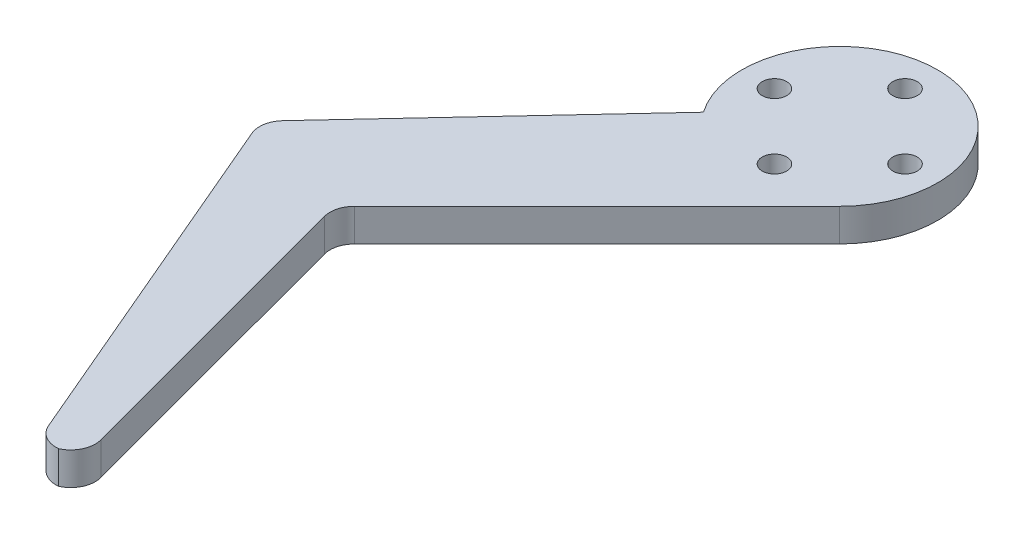
ISO-10303-21;
HEADER;
FILE_DESCRIPTION(('STEP AP214'),'2;1');
FILE_NAME('part.step','',(''),(''),'','','');
FILE_SCHEMA(('AUTOMOTIVE_DESIGN { 1 0 10303 214 1 1 1 1 }'));
ENDSEC;
DATA;
#1=APPLICATION_CONTEXT('core data for automotive mechanical design processes');
#2=APPLICATION_PROTOCOL_DEFINITION('international standard','automotive_design',2000,#1);
#3=PRODUCT_CONTEXT('',#1,'mechanical');
#4=PRODUCT('Part','Part','',(#3));
#5=PRODUCT_RELATED_PRODUCT_CATEGORY('part','',(#4));
#6=PRODUCT_DEFINITION_FORMATION('','',#4);
#7=PRODUCT_DEFINITION_CONTEXT('part definition',#1,'design');
#8=PRODUCT_DEFINITION('design','',#6,#7);
#9=PRODUCT_DEFINITION_SHAPE('','',#8);
#10=(LENGTH_UNIT() NAMED_UNIT(*) SI_UNIT(.MILLI.,.METRE.));
#11=(NAMED_UNIT(*) PLANE_ANGLE_UNIT() SI_UNIT($,.RADIAN.));
#12=(NAMED_UNIT(*) SI_UNIT($,.STERADIAN.) SOLID_ANGLE_UNIT());
#13=UNCERTAINTY_MEASURE_WITH_UNIT(LENGTH_MEASURE(1.E-05),#10,'distance_accuracy_value','');
#14=(GEOMETRIC_REPRESENTATION_CONTEXT(3) GLOBAL_UNCERTAINTY_ASSIGNED_CONTEXT((#13)) GLOBAL_UNIT_ASSIGNED_CONTEXT((#10,
#11,#12)) REPRESENTATION_CONTEXT('',''));
#15=CARTESIAN_POINT('',(0.,0.,0.));
#16=DIRECTION('',(0.,0.,1.));
#17=DIRECTION('',(1.,0.,0.));
#18=AXIS2_PLACEMENT_3D('',#15,#16,#17);
#19=CARTESIAN_POINT('',(0.,4.,0.));
#20=DIRECTION('',(0.,1.,0.));
#21=DIRECTION('',(0.,0.,1.));
#22=AXIS2_PLACEMENT_3D('',#19,#20,#21);
#23=PLANE('',#22);
#24=CARTESIAN_POINT('',(0.,4.,8.));
#25=DIRECTION('',(0.,1.,0.));
#26=DIRECTION('',(0.,0.,1.));
#27=AXIS2_PLACEMENT_3D('',#24,#25,#26);
#28=CIRCLE('',#27,1.5);
#29=CARTESIAN_POINT('',(0.,4.,9.5));
#30=VERTEX_POINT('',#29);
#31=EDGE_CURVE('E208',#30,#30,#28,.T.);
#32=ORIENTED_EDGE('',*,*,#31,.F.);
#33=EDGE_LOOP('',(#32));
#34=FACE_BOUND('',#33,.T.);
#35=CARTESIAN_POINT('',(0.,4.,-8.));
#36=DIRECTION('',(0.,1.,0.));
#37=DIRECTION('',(0.,0.,1.));
#38=AXIS2_PLACEMENT_3D('',#35,#36,#37);
#39=CIRCLE('',#38,1.5);
#40=CARTESIAN_POINT('',(0.,4.,-6.5));
#41=VERTEX_POINT('',#40);
#42=EDGE_CURVE('E184',#41,#41,#39,.T.);
#43=ORIENTED_EDGE('',*,*,#42,.F.);
#44=EDGE_LOOP('',(#43));
#45=FACE_BOUND('',#44,.T.);
#46=DIRECTION('',(-0.682000049696105,0.,0.731352126006693));
#47=VECTOR('',#46,1.);
#48=CARTESIAN_POINT('',(-36.0477490683532,4.,34.9435246459221));
#49=LINE('',#48,#47);
#50=CARTESIAN_POINT('',(-9.85159573268039,4.,6.85171960312398));
#51=VERTEX_POINT('',#50);
#52=CARTESIAN_POINT('',(-34.7159837227266,4.,33.515387775111));
#53=VERTEX_POINT('',#52);
#54=EDGE_CURVE('E103',#51,#53,#49,.T.);
#55=ORIENTED_EDGE('',*,*,#54,.T.);
#56=CARTESIAN_POINT('',(-32.5219273447065,4.,35.5613879241993));
#57=DIRECTION('',(0.,1.,0.));
#58=DIRECTION('',(0.,0.,1.));
#59=AXIS2_PLACEMENT_3D('',#56,#57,#58);
#60=CIRCLE('',#59,3.);
#61=CARTESIAN_POINT('',(-35.2809600085623,4.,36.7394111666598));
#62=VERTEX_POINT('',#61);
#63=EDGE_CURVE('E148',#53,#62,#60,.T.);
#64=ORIENTED_EDGE('',*,*,#63,.T.);
#65=DIRECTION('',(0.392674414153484,0.,0.919677554618584));
#66=VECTOR('',#65,1.);
#67=CARTESIAN_POINT('',(-15.6800453841502,4.,82.6464542036449));
#68=LINE('',#67,#66);
#69=CARTESIAN_POINT('',(-16.7016030868715,4.,80.2538774120915));
#70=VERTEX_POINT('',#69);
#71=EDGE_CURVE('E113',#62,#70,#68,.T.);
#72=ORIENTED_EDGE('',*,*,#71,.T.);
#73=CARTESIAN_POINT('',(-13.9425704230157,4.,79.075854169631));
#74=DIRECTION('',(0.,1.,0.));
#75=DIRECTION('',(0.,0.,1.));
#76=AXIS2_PLACEMENT_3D('',#73,#74,#75);
#77=CIRCLE('',#76,3.);
#78=CARTESIAN_POINT('',(-13.6523806970116,4.,82.0617861720252));
#79=VERTEX_POINT('',#78);
#80=EDGE_CURVE('E49',#70,#79,#77,.T.);
#81=ORIENTED_EDGE('',*,*,#80,.T.);
#82=CARTESIAN_POINT('',(-14.8924461188136,4.,79.3300764968125));
#83=DIRECTION('',(0.,1.,0.));
#84=DIRECTION('',(0.,0.,1.));
#85=AXIS2_PLACEMENT_3D('',#82,#83,#84);
#86=CIRCLE('',#85,3.);
#87=CARTESIAN_POINT('',(-11.9944429187215,4.,78.5544622549008));
#88=VERTEX_POINT('',#87);
#89=EDGE_CURVE('E145',#79,#88,#86,.T.);
#90=ORIENTED_EDGE('',*,*,#89,.T.);
#91=DIRECTION('',(-0.258538080637228,0.,-0.96600106669735));
#92=VECTOR('',#91,1.);
#93=CARTESIAN_POINT('',(-22.4643106676899,4.,39.4348734161676));
#94=LINE('',#93,#92);
#95=CARTESIAN_POINT('',(-22.0166599628016,4.,41.1074744402182));
#96=VERTEX_POINT('',#95);
#97=EDGE_CURVE('E177',#88,#96,#94,.T.);
#98=ORIENTED_EDGE('',*,*,#97,.T.);
#99=CARTESIAN_POINT('',(-19.1186567627096,4.,40.3318601983065));
#100=DIRECTION('',(0.,1.,0.));
#101=DIRECTION('',(0.,0.,1.));
#102=AXIS2_PLACEMENT_3D('',#99,#100,#101);
#103=CIRCLE('',#102,3.);
#104=CARTESIAN_POINT('',(-21.2399771062692,4.,38.2105398547469));
#105=VERTEX_POINT('',#104);
#106=EDGE_CURVE('E11',#96,#105,#103,.F.);
#107=ORIENTED_EDGE('',*,*,#106,.T.);
#108=DIRECTION('',(0.707106781186541,0.,-0.707106781186554));
#109=VECTOR('',#108,1.);
#110=CARTESIAN_POINT('',(0.,4.,16.9705627484773));
#111=LINE('',#110,#109);
#112=CARTESIAN_POINT('',(8.48528137423867,4.,8.48528137423847));
#113=VERTEX_POINT('',#112);
#114=EDGE_CURVE('E118',#105,#113,#111,.T.);
#115=ORIENTED_EDGE('',*,*,#114,.T.);
#116=CARTESIAN_POINT('',(0.,4.,0.));
#117=DIRECTION('',(0.,1.,0.));
#118=DIRECTION('',(0.,0.,1.));
#119=AXIS2_PLACEMENT_3D('',#116,#117,#118);
#120=CIRCLE('',#119,12.);
#121=EDGE_CURVE('E114',#113,#51,#120,.T.);
#122=ORIENTED_EDGE('',*,*,#121,.T.);
#123=EDGE_LOOP('',(#55,#64,#72,#81,#90,#98,#107,#115,#122));
#124=FACE_BOUND('',#123,.T.);
#125=CARTESIAN_POINT('',(8.,4.,0.));
#126=DIRECTION('',(0.,1.,0.));
#127=DIRECTION('',(0.,0.,1.));
#128=AXIS2_PLACEMENT_3D('',#125,#126,#127);
#129=CIRCLE('',#128,1.5);
#130=CARTESIAN_POINT('',(8.,4.,1.5));
#131=VERTEX_POINT('',#130);
#132=EDGE_CURVE('E214',#131,#131,#129,.T.);
#133=ORIENTED_EDGE('',*,*,#132,.F.);
#134=EDGE_LOOP('',(#133));
#135=FACE_BOUND('',#134,.T.);
#136=CARTESIAN_POINT('',(-8.,4.,0.));
#137=DIRECTION('',(0.,1.,0.));
#138=DIRECTION('',(0.,0.,1.));
#139=AXIS2_PLACEMENT_3D('',#136,#137,#138);
#140=CIRCLE('',#139,1.5);
#141=CARTESIAN_POINT('',(-8.,4.,1.5));
#142=VERTEX_POINT('',#141);
#143=EDGE_CURVE('E200',#142,#142,#140,.T.);
#144=ORIENTED_EDGE('',*,*,#143,.F.);
#145=EDGE_LOOP('',(#144));
#146=FACE_BOUND('',#145,.T.);
#147=ADVANCED_FACE('F33',(#34,#45,#124,#135,#146),#23,.T.);
#148=CARTESIAN_POINT('',(0.,0.,0.));
#149=DIRECTION('',(0.,1.,0.));
#150=DIRECTION('',(0.,0.,1.));
#151=AXIS2_PLACEMENT_3D('',#148,#149,#150);
#152=PLANE('',#151);
#153=CARTESIAN_POINT('',(0.,0.,8.));
#154=DIRECTION('',(0.,1.,0.));
#155=DIRECTION('',(0.,0.,1.));
#156=AXIS2_PLACEMENT_3D('',#153,#154,#155);
#157=CIRCLE('',#156,1.5);
#158=CARTESIAN_POINT('',(0.,0.,9.5));
#159=VERTEX_POINT('',#158);
#160=EDGE_CURVE('E205',#159,#159,#157,.T.);
#161=ORIENTED_EDGE('',*,*,#160,.T.);
#162=EDGE_LOOP('',(#161));
#163=FACE_BOUND('',#162,.T.);
#164=CARTESIAN_POINT('',(0.,0.,-8.));
#165=DIRECTION('',(0.,1.,0.));
#166=DIRECTION('',(0.,0.,1.));
#167=AXIS2_PLACEMENT_3D('',#164,#165,#166);
#168=CIRCLE('',#167,1.5);
#169=CARTESIAN_POINT('',(0.,0.,-6.5));
#170=VERTEX_POINT('',#169);
#171=EDGE_CURVE('E217',#170,#170,#168,.T.);
#172=ORIENTED_EDGE('',*,*,#171,.T.);
#173=EDGE_LOOP('',(#172));
#174=FACE_BOUND('',#173,.T.);
#175=DIRECTION('',(0.392674414153484,0.,0.919677554618584));
#176=VECTOR('',#175,1.);
#177=CARTESIAN_POINT('',(-15.6800453841502,0.,82.6464542036449));
#178=LINE('',#177,#176);
#179=CARTESIAN_POINT('',(-35.2809600085623,0.,36.7394111666598));
#180=VERTEX_POINT('',#179);
#181=CARTESIAN_POINT('',(-16.7016030868715,0.,80.2538774120915));
#182=VERTEX_POINT('',#181);
#183=EDGE_CURVE('E173',#180,#182,#178,.T.);
#184=ORIENTED_EDGE('',*,*,#183,.F.);
#185=CARTESIAN_POINT('',(-32.5219273447065,0.,35.5613879241993));
#186=DIRECTION('',(0.,1.,0.));
#187=DIRECTION('',(0.,0.,1.));
#188=AXIS2_PLACEMENT_3D('',#185,#186,#187);
#189=CIRCLE('',#188,3.);
#190=CARTESIAN_POINT('',(-34.7159837227266,0.,33.515387775111));
#191=VERTEX_POINT('',#190);
#192=EDGE_CURVE('E142',#180,#191,#189,.F.);
#193=ORIENTED_EDGE('',*,*,#192,.T.);
#194=DIRECTION('',(-0.682000049696105,0.,0.731352126006693));
#195=VECTOR('',#194,1.);
#196=CARTESIAN_POINT('',(-36.0477490683532,0.,34.9435246459221));
#197=LINE('',#196,#195);
#198=CARTESIAN_POINT('',(-9.85159573268039,0.,6.85171960312398));
#199=VERTEX_POINT('',#198);
#200=EDGE_CURVE('E183',#199,#191,#197,.T.);
#201=ORIENTED_EDGE('',*,*,#200,.F.);
#202=CARTESIAN_POINT('',(0.,0.,0.));
#203=DIRECTION('',(0.,1.,0.));
#204=DIRECTION('',(0.,0.,1.));
#205=AXIS2_PLACEMENT_3D('',#202,#203,#204);
#206=CIRCLE('',#205,12.);
#207=CARTESIAN_POINT('',(8.48528137423867,0.,8.48528137423847));
#208=VERTEX_POINT('',#207);
#209=EDGE_CURVE('E126',#208,#199,#206,.T.);
#210=ORIENTED_EDGE('',*,*,#209,.F.);
#211=DIRECTION('',(0.707106781186541,0.,-0.707106781186554));
#212=VECTOR('',#211,1.);
#213=CARTESIAN_POINT('',(8.48528137423867,0.,8.48528137423847));
#214=LINE('',#213,#212);
#215=CARTESIAN_POINT('',(-21.2399771062692,0.,38.2105398547469));
#216=VERTEX_POINT('',#215);
#217=EDGE_CURVE('E122',#216,#208,#214,.T.);
#218=ORIENTED_EDGE('',*,*,#217,.F.);
#219=CARTESIAN_POINT('',(-19.1186567627096,0.,40.3318601983065));
#220=DIRECTION('',(0.,1.,0.));
#221=DIRECTION('',(0.,0.,1.));
#222=AXIS2_PLACEMENT_3D('',#219,#220,#221);
#223=CIRCLE('',#222,3.);
#224=CARTESIAN_POINT('',(-22.0166599628016,0.,41.1074744402182));
#225=VERTEX_POINT('',#224);
#226=EDGE_CURVE('E42',#216,#225,#223,.T.);
#227=ORIENTED_EDGE('',*,*,#226,.T.);
#228=DIRECTION('',(-0.258538080637228,0.,-0.96600106669735));
#229=VECTOR('',#228,1.);
#230=CARTESIAN_POINT('',(-22.4643106676899,0.,39.4348734161676));
#231=LINE('',#230,#229);
#232=CARTESIAN_POINT('',(-11.9944429187215,0.,78.5544622549008));
#233=VERTEX_POINT('',#232);
#234=EDGE_CURVE('E164',#233,#225,#231,.T.);
#235=ORIENTED_EDGE('',*,*,#234,.F.);
#236=CARTESIAN_POINT('',(-14.8924461188136,0.,79.3300764968125));
#237=DIRECTION('',(0.,1.,0.));
#238=DIRECTION('',(0.,0.,1.));
#239=AXIS2_PLACEMENT_3D('',#236,#237,#238);
#240=CIRCLE('',#239,3.);
#241=CARTESIAN_POINT('',(-13.6523806970116,0.,82.0617861720252));
#242=VERTEX_POINT('',#241);
#243=EDGE_CURVE('E138',#233,#242,#240,.F.);
#244=ORIENTED_EDGE('',*,*,#243,.T.);
#245=CARTESIAN_POINT('',(-13.9425704230157,0.,79.075854169631));
#246=DIRECTION('',(0.,1.,0.));
#247=DIRECTION('',(0.,0.,1.));
#248=AXIS2_PLACEMENT_3D('',#245,#246,#247);
#249=CIRCLE('',#248,3.);
#250=EDGE_CURVE('E140',#242,#182,#249,.F.);
#251=ORIENTED_EDGE('',*,*,#250,.T.);
#252=EDGE_LOOP('',(#184,#193,#201,#210,#218,#227,#235,#244,#251));
#253=FACE_BOUND('',#252,.T.);
#254=CARTESIAN_POINT('',(8.,0.,0.));
#255=DIRECTION('',(0.,1.,0.));
#256=DIRECTION('',(0.,0.,1.));
#257=AXIS2_PLACEMENT_3D('',#254,#255,#256);
#258=CIRCLE('',#257,1.5);
#259=CARTESIAN_POINT('',(8.,0.,1.5));
#260=VERTEX_POINT('',#259);
#261=EDGE_CURVE('E211',#260,#260,#258,.T.);
#262=ORIENTED_EDGE('',*,*,#261,.T.);
#263=EDGE_LOOP('',(#262));
#264=FACE_BOUND('',#263,.T.);
#265=CARTESIAN_POINT('',(-8.,0.,0.));
#266=DIRECTION('',(0.,1.,0.));
#267=DIRECTION('',(0.,0.,1.));
#268=AXIS2_PLACEMENT_3D('',#265,#266,#267);
#269=CIRCLE('',#268,1.5);
#270=CARTESIAN_POINT('',(-8.,0.,1.5));
#271=VERTEX_POINT('',#270);
#272=EDGE_CURVE('E198',#271,#271,#269,.T.);
#273=ORIENTED_EDGE('',*,*,#272,.T.);
#274=EDGE_LOOP('',(#273));
#275=FACE_BOUND('',#274,.T.);
#276=ADVANCED_FACE('F162',(#163,#174,#253,#264,#275),#152,.F.);
#277=CARTESIAN_POINT('',(0.,4.,0.));
#278=DIRECTION('',(0.,-1.,0.));
#279=DIRECTION('',(0.,0.,-1.));
#280=AXIS2_PLACEMENT_3D('',#277,#278,#279);
#281=CYLINDRICAL_SURFACE('',#280,12.);
#282=ORIENTED_EDGE('',*,*,#209,.T.);
#283=DIRECTION('',(0.,-1.,0.));
#284=VECTOR('',#283,1.);
#285=CARTESIAN_POINT('',(-9.85159573268039,4.,6.85171960312398));
#286=LINE('',#285,#284);
#287=EDGE_CURVE('E108',#51,#199,#286,.T.);
#288=ORIENTED_EDGE('',*,*,#287,.F.);
#289=ORIENTED_EDGE('',*,*,#121,.F.);
#290=DIRECTION('',(0.,-1.,0.));
#291=VECTOR('',#290,1.);
#292=CARTESIAN_POINT('',(8.48528137423867,4.,8.48528137423847));
#293=LINE('',#292,#291);
#294=EDGE_CURVE('E128',#113,#208,#293,.T.);
#295=ORIENTED_EDGE('',*,*,#294,.T.);
#296=EDGE_LOOP('',(#282,#288,#289,#295));
#297=FACE_BOUND('',#296,.T.);
#298=ADVANCED_FACE('F124',(#297),#281,.T.);
#299=CARTESIAN_POINT('',(-36.0477490683532,4.,34.9435246459221));
#300=DIRECTION('',(0.731352126006693,0.,0.682000049696105));
#301=DIRECTION('',(0.682000049696105,0.,-0.731352126006693));
#302=AXIS2_PLACEMENT_3D('',#299,#300,#301);
#303=PLANE('',#302);
#304=ORIENTED_EDGE('',*,*,#200,.T.);
#305=DIRECTION('',(0.,-1.,0.));
#306=VECTOR('',#305,1.);
#307=CARTESIAN_POINT('',(-34.7159837227266,4.,33.515387775111));
#308=LINE('',#307,#306);
#309=EDGE_CURVE('E111',#191,#53,#308,.F.);
#310=ORIENTED_EDGE('',*,*,#309,.T.);
#311=ORIENTED_EDGE('',*,*,#54,.F.);
#312=ORIENTED_EDGE('',*,*,#287,.T.);
#313=EDGE_LOOP('',(#304,#310,#311,#312));
#314=FACE_BOUND('',#313,.T.);
#315=ADVANCED_FACE('F106',(#314),#303,.F.);
#316=CARTESIAN_POINT('',(-15.6800453841502,4.,82.6464542036449));
#317=DIRECTION('',(0.919677554618584,0.,-0.392674414153484));
#318=DIRECTION('',(-0.392674414153484,0.,-0.919677554618584));
#319=AXIS2_PLACEMENT_3D('',#316,#317,#318);
#320=PLANE('',#319);
#321=ORIENTED_EDGE('',*,*,#71,.F.);
#322=DIRECTION('',(0.,-1.,0.));
#323=VECTOR('',#322,1.);
#324=CARTESIAN_POINT('',(-35.2809600085623,4.,36.7394111666598));
#325=LINE('',#324,#323);
#326=EDGE_CURVE('E131',#62,#180,#325,.T.);
#327=ORIENTED_EDGE('',*,*,#326,.T.);
#328=ORIENTED_EDGE('',*,*,#183,.T.);
#329=DIRECTION('',(0.,-1.,0.));
#330=VECTOR('',#329,1.);
#331=CARTESIAN_POINT('',(-16.7016030868715,4.,80.2538774120915));
#332=LINE('',#331,#330);
#333=EDGE_CURVE('E127',#182,#70,#332,.F.);
#334=ORIENTED_EDGE('',*,*,#333,.T.);
#335=EDGE_LOOP('',(#321,#327,#328,#334));
#336=FACE_BOUND('',#335,.T.);
#337=ADVANCED_FACE('F190',(#336),#320,.F.);
#338=CARTESIAN_POINT('',(-22.4643106676899,4.,39.4348734161676));
#339=DIRECTION('',(-0.96600106669735,0.,0.258538080637228));
#340=DIRECTION('',(0.258538080637228,0.,0.96600106669735));
#341=AXIS2_PLACEMENT_3D('',#338,#339,#340);
#342=PLANE('',#341);
#343=ORIENTED_EDGE('',*,*,#97,.F.);
#344=DIRECTION('',(0.,-1.,0.));
#345=VECTOR('',#344,1.);
#346=CARTESIAN_POINT('',(-11.9944429187215,4.,78.5544622549008));
#347=LINE('',#346,#345);
#348=EDGE_CURVE('E152',#88,#233,#347,.T.);
#349=ORIENTED_EDGE('',*,*,#348,.T.);
#350=ORIENTED_EDGE('',*,*,#234,.T.);
#351=DIRECTION('',(0.,-1.,0.));
#352=VECTOR('',#351,1.);
#353=CARTESIAN_POINT('',(-22.0166599628016,4.,41.1074744402182));
#354=LINE('',#353,#352);
#355=EDGE_CURVE('E150',#225,#96,#354,.F.);
#356=ORIENTED_EDGE('',*,*,#355,.T.);
#357=EDGE_LOOP('',(#343,#349,#350,#356));
#358=FACE_BOUND('',#357,.T.);
#359=ADVANCED_FACE('F171',(#358),#342,.F.);
#360=CARTESIAN_POINT('',(8.48528137423867,4.,8.48528137423847));
#361=DIRECTION('',(-0.707106781186554,0.,-0.707106781186541));
#362=DIRECTION('',(-0.707106781186541,0.,0.707106781186554));
#363=AXIS2_PLACEMENT_3D('',#360,#361,#362);
#364=PLANE('',#363);
#365=ORIENTED_EDGE('',*,*,#114,.F.);
#366=DIRECTION('',(0.,-1.,0.));
#367=VECTOR('',#366,1.);
#368=CARTESIAN_POINT('',(-21.2399771062692,0.,38.2105398547469));
#369=LINE('',#368,#367);
#370=EDGE_CURVE('E154',#105,#216,#369,.T.);
#371=ORIENTED_EDGE('',*,*,#370,.T.);
#372=ORIENTED_EDGE('',*,*,#217,.T.);
#373=ORIENTED_EDGE('',*,*,#294,.F.);
#374=EDGE_LOOP('',(#365,#371,#372,#373));
#375=FACE_BOUND('',#374,.T.);
#376=ADVANCED_FACE('F176',(#375),#364,.F.);
#377=CARTESIAN_POINT('',(0.,4.,-8.));
#378=DIRECTION('',(0.,-1.,0.));
#379=DIRECTION('',(0.,0.,-1.));
#380=AXIS2_PLACEMENT_3D('',#377,#378,#379);
#381=CYLINDRICAL_SURFACE('',#380,1.5);
#382=ORIENTED_EDGE('',*,*,#42,.T.);
#383=EDGE_LOOP('',(#382));
#384=FACE_BOUND('',#383,.T.);
#385=ORIENTED_EDGE('',*,*,#171,.F.);
#386=EDGE_LOOP('',(#385));
#387=FACE_BOUND('',#386,.T.);
#388=ADVANCED_FACE('F249',(#384,#387),#381,.F.);
#389=CARTESIAN_POINT('',(8.,4.,0.));
#390=DIRECTION('',(0.,-1.,0.));
#391=DIRECTION('',(0.,0.,-1.));
#392=AXIS2_PLACEMENT_3D('',#389,#390,#391);
#393=CYLINDRICAL_SURFACE('',#392,1.5);
#394=ORIENTED_EDGE('',*,*,#132,.T.);
#395=EDGE_LOOP('',(#394));
#396=FACE_BOUND('',#395,.T.);
#397=ORIENTED_EDGE('',*,*,#261,.F.);
#398=EDGE_LOOP('',(#397));
#399=FACE_BOUND('',#398,.T.);
#400=ADVANCED_FACE('F286',(#396,#399),#393,.F.);
#401=CARTESIAN_POINT('',(0.,4.,8.));
#402=DIRECTION('',(0.,-1.,0.));
#403=DIRECTION('',(0.,0.,-1.));
#404=AXIS2_PLACEMENT_3D('',#401,#402,#403);
#405=CYLINDRICAL_SURFACE('',#404,1.5);
#406=ORIENTED_EDGE('',*,*,#31,.T.);
#407=EDGE_LOOP('',(#406));
#408=FACE_BOUND('',#407,.T.);
#409=ORIENTED_EDGE('',*,*,#160,.F.);
#410=EDGE_LOOP('',(#409));
#411=FACE_BOUND('',#410,.T.);
#412=ADVANCED_FACE('F233',(#408,#411),#405,.F.);
#413=CARTESIAN_POINT('',(-8.,4.,0.));
#414=DIRECTION('',(0.,-1.,0.));
#415=DIRECTION('',(0.,0.,-1.));
#416=AXIS2_PLACEMENT_3D('',#413,#414,#415);
#417=CYLINDRICAL_SURFACE('',#416,1.5);
#418=ORIENTED_EDGE('',*,*,#143,.T.);
#419=EDGE_LOOP('',(#418));
#420=FACE_BOUND('',#419,.T.);
#421=ORIENTED_EDGE('',*,*,#272,.F.);
#422=EDGE_LOOP('',(#421));
#423=FACE_BOUND('',#422,.T.);
#424=ADVANCED_FACE('F227',(#420,#423),#417,.F.);
#425=CARTESIAN_POINT('',(-32.5219273447065,4.,35.5613879241993));
#426=DIRECTION('',(0.,-1.,0.));
#427=DIRECTION('',(0.,0.,-1.));
#428=AXIS2_PLACEMENT_3D('',#425,#426,#427);
#429=CYLINDRICAL_SURFACE('',#428,3.);
#430=ORIENTED_EDGE('',*,*,#63,.F.);
#431=ORIENTED_EDGE('',*,*,#309,.F.);
#432=ORIENTED_EDGE('',*,*,#192,.F.);
#433=ORIENTED_EDGE('',*,*,#326,.F.);
#434=EDGE_LOOP('',(#430,#431,#432,#433));
#435=FACE_BOUND('',#434,.T.);
#436=ADVANCED_FACE('F224',(#435),#429,.T.);
#437=CARTESIAN_POINT('',(-14.8924461188136,4.,79.3300764968125));
#438=DIRECTION('',(0.,-1.,0.));
#439=DIRECTION('',(0.,0.,-1.));
#440=AXIS2_PLACEMENT_3D('',#437,#438,#439);
#441=CYLINDRICAL_SURFACE('',#440,3.);
#442=ORIENTED_EDGE('',*,*,#348,.F.);
#443=ORIENTED_EDGE('',*,*,#89,.F.);
#444=DIRECTION('',(0.,-1.,0.));
#445=VECTOR('',#444,1.);
#446=CARTESIAN_POINT('',(-13.6523806970116,2.,82.0617861720252));
#447=LINE('',#446,#445);
#448=EDGE_CURVE('E37',#242,#79,#447,.F.);
#449=ORIENTED_EDGE('',*,*,#448,.F.);
#450=ORIENTED_EDGE('',*,*,#243,.F.);
#451=EDGE_LOOP('',(#442,#443,#449,#450));
#452=FACE_BOUND('',#451,.T.);
#453=ADVANCED_FACE('F226',(#452),#441,.T.);
#454=CARTESIAN_POINT('',(-13.9425704230157,4.,79.075854169631));
#455=DIRECTION('',(0.,-1.,0.));
#456=DIRECTION('',(0.,0.,-1.));
#457=AXIS2_PLACEMENT_3D('',#454,#455,#456);
#458=CYLINDRICAL_SURFACE('',#457,3.);
#459=ORIENTED_EDGE('',*,*,#80,.F.);
#460=ORIENTED_EDGE('',*,*,#333,.F.);
#461=ORIENTED_EDGE('',*,*,#250,.F.);
#462=ORIENTED_EDGE('',*,*,#448,.T.);
#463=EDGE_LOOP('',(#459,#460,#461,#462));
#464=FACE_BOUND('',#463,.T.);
#465=ADVANCED_FACE('F194',(#464),#458,.T.);
#466=CARTESIAN_POINT('',(-19.1186567627096,4.,40.3318601983065));
#467=DIRECTION('',(0.,1.,0.));
#468=DIRECTION('',(0.,0.,1.));
#469=AXIS2_PLACEMENT_3D('',#466,#467,#468);
#470=CYLINDRICAL_SURFACE('',#469,3.);
#471=ORIENTED_EDGE('',*,*,#106,.F.);
#472=ORIENTED_EDGE('',*,*,#355,.F.);
#473=ORIENTED_EDGE('',*,*,#226,.F.);
#474=ORIENTED_EDGE('',*,*,#370,.F.);
#475=EDGE_LOOP('',(#471,#472,#473,#474));
#476=FACE_BOUND('',#475,.T.);
#477=ADVANCED_FACE('F35',(#476),#470,.F.);
#478=CLOSED_SHELL('',(#147,#276,#298,#315,#337,#359,#376,#388,#400,#412,#424,#436,#453,#465,#477));
#479=MANIFOLD_SOLID_BREP('B2',#478);
#480=ADVANCED_BREP_SHAPE_REPRESENTATION('',(#18,#479),#14);
#481=SHAPE_DEFINITION_REPRESENTATION(#9,#480);
ENDSEC;
END-ISO-10303-21;
